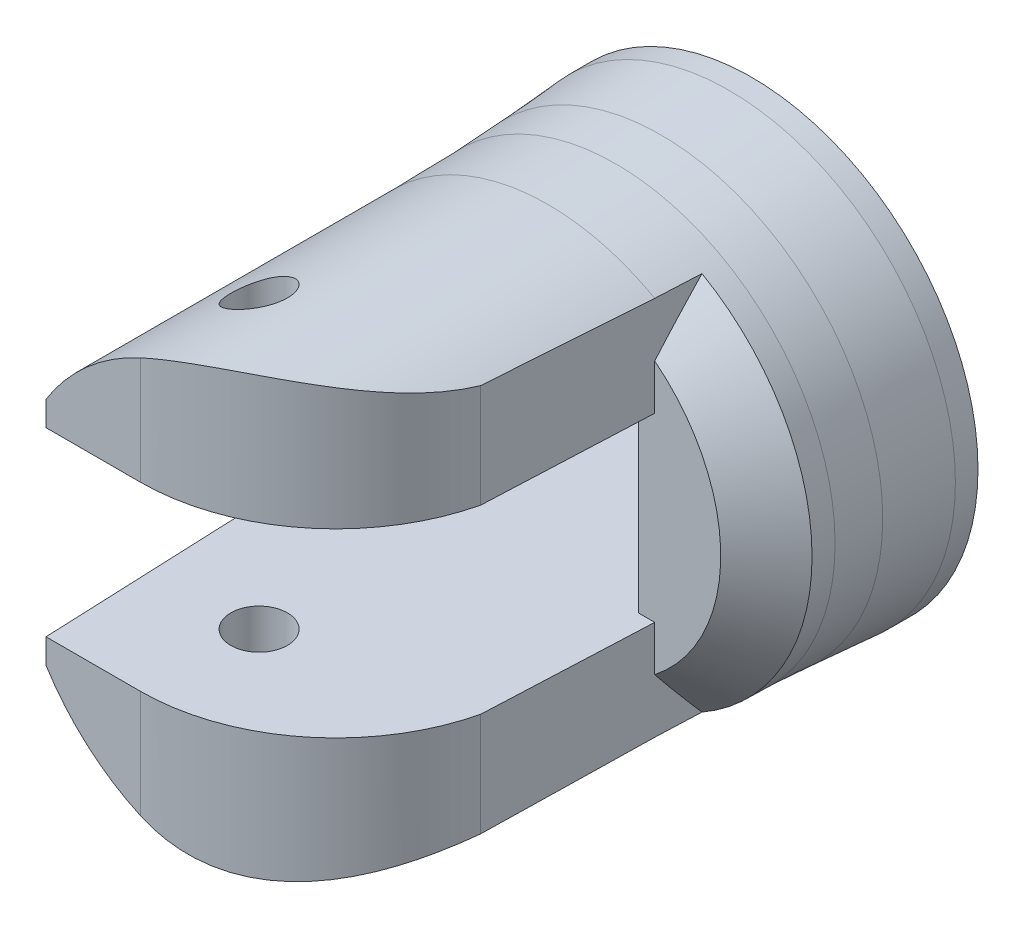
ISO-10303-21;
HEADER;
FILE_DESCRIPTION(('STEP AP214'),'2;1');
FILE_NAME('part.step','',(''),(''),'','','');
FILE_SCHEMA(('AUTOMOTIVE_DESIGN { 1 0 10303 214 1 1 1 1 }'));
ENDSEC;
DATA;
#1=APPLICATION_CONTEXT('core data for automotive mechanical design processes');
#2=APPLICATION_PROTOCOL_DEFINITION('international standard','automotive_design',2000,#1);
#3=PRODUCT_CONTEXT('',#1,'mechanical');
#4=PRODUCT('Part','Part','',(#3));
#5=PRODUCT_RELATED_PRODUCT_CATEGORY('part','',(#4));
#6=PRODUCT_DEFINITION_FORMATION('','',#4);
#7=PRODUCT_DEFINITION_CONTEXT('part definition',#1,'design');
#8=PRODUCT_DEFINITION('design','',#6,#7);
#9=PRODUCT_DEFINITION_SHAPE('','',#8);
#10=(LENGTH_UNIT() NAMED_UNIT(*) SI_UNIT(.MILLI.,.METRE.));
#11=(NAMED_UNIT(*) PLANE_ANGLE_UNIT() SI_UNIT($,.RADIAN.));
#12=(NAMED_UNIT(*) SI_UNIT($,.STERADIAN.) SOLID_ANGLE_UNIT());
#13=UNCERTAINTY_MEASURE_WITH_UNIT(LENGTH_MEASURE(1.E-05),#10,'distance_accuracy_value','');
#14=(GEOMETRIC_REPRESENTATION_CONTEXT(3) GLOBAL_UNCERTAINTY_ASSIGNED_CONTEXT((#13)) GLOBAL_UNIT_ASSIGNED_CONTEXT((#10,
#11,#12)) REPRESENTATION_CONTEXT('',''));
#15=CARTESIAN_POINT('',(0.,0.,0.));
#16=DIRECTION('',(0.,0.,1.));
#17=DIRECTION('',(1.,0.,0.));
#18=AXIS2_PLACEMENT_3D('',#15,#16,#17);
#19=CARTESIAN_POINT('',(13.,-4.,9.));
#20=DIRECTION('',(0.,0.,1.));
#21=DIRECTION('',(1.,0.,0.));
#22=AXIS2_PLACEMENT_3D('',#19,#20,#21);
#23=PLANE('',#22);
#24=DIRECTION('',(0.,-1.,0.));
#25=VECTOR('',#24,1.);
#26=CARTESIAN_POINT('',(4.71669943852547,13.,9.));
#27=LINE('',#26,#25);
#28=CARTESIAN_POINT('',(4.71669943852547,-3.99999999999999,9.));
#29=VERTEX_POINT('',#28);
#30=CARTESIAN_POINT('',(4.71669943852547,-6.00133550920778,9.));
#31=VERTEX_POINT('',#30);
#32=EDGE_CURVE('E187',#29,#31,#27,.T.);
#33=ORIENTED_EDGE('',*,*,#32,.T.);
#34=CARTESIAN_POINT('',(0.,0.,9.));
#35=DIRECTION('',(0.,0.,1.));
#36=DIRECTION('',(1.,0.,0.));
#37=AXIS2_PLACEMENT_3D('',#34,#35,#36);
#38=CIRCLE('',#37,7.63303881081872);
#39=CARTESIAN_POINT('',(4.71669943852547,6.00133550920779,9.));
#40=VERTEX_POINT('',#39);
#41=EDGE_CURVE('E241',#31,#40,#38,.T.);
#42=ORIENTED_EDGE('',*,*,#41,.T.);
#43=CARTESIAN_POINT('',(4.71669943852547,4.,9.));
#44=VERTEX_POINT('',#43);
#45=EDGE_CURVE('E190',#40,#44,#27,.T.);
#46=ORIENTED_EDGE('',*,*,#45,.T.);
#47=DIRECTION('',(-1.,0.,0.));
#48=VECTOR('',#47,1.);
#49=CARTESIAN_POINT('',(13.,4.,9.));
#50=LINE('',#49,#48);
#51=CARTESIAN_POINT('',(4.,4.,9.));
#52=VERTEX_POINT('',#51);
#53=EDGE_CURVE('E287',#44,#52,#50,.T.);
#54=ORIENTED_EDGE('',*,*,#53,.T.);
#55=DIRECTION('',(0.,1.,0.));
#56=VECTOR('',#55,1.);
#57=CARTESIAN_POINT('',(4.,-4.,9.));
#58=LINE('',#57,#56);
#59=CARTESIAN_POINT('',(4.,-4.,9.));
#60=VERTEX_POINT('',#59);
#61=EDGE_CURVE('E244',#60,#52,#58,.T.);
#62=ORIENTED_EDGE('',*,*,#61,.F.);
#63=DIRECTION('',(-1.,0.,0.));
#64=VECTOR('',#63,1.);
#65=CARTESIAN_POINT('',(13.,-4.,9.));
#66=LINE('',#65,#64);
#67=EDGE_CURVE('E291',#29,#60,#66,.T.);
#68=ORIENTED_EDGE('',*,*,#67,.F.);
#69=EDGE_LOOP('',(#33,#42,#46,#54,#62,#68));
#70=FACE_BOUND('',#69,.T.);
#71=ADVANCED_FACE('F33',(#70),#23,.T.);
#72=CARTESIAN_POINT('',(0.,0.,23.));
#73=DIRECTION('',(0.,0.,-1.));
#74=DIRECTION('',(-1.,0.,0.));
#75=AXIS2_PLACEMENT_3D('',#72,#73,#74);
#76=CYLINDRICAL_SURFACE('',#75,9.63303881081873);
#77=CARTESIAN_POINT('',(-3.76330056147453,8.86752533769966,19.25));
#78=CARTESIAN_POINT('',(-3.84052638297433,8.83474952902866,19.2499971918312));
#79=CARTESIAN_POINT('',(-3.91738770307995,8.80092839083558,19.2428267136695));
#80=CARTESIAN_POINT('',(-4.06817143072535,8.73225706821625,19.2146837344494));
#81=CARTESIAN_POINT('',(-4.14208817010863,8.69740510475551,19.1936858605097));
#82=CARTESIAN_POINT('',(-4.28489639896187,8.62794274183643,19.1385469019413));
#83=CARTESIAN_POINT('',(-4.35379212544453,8.59333216152438,19.1044170552013));
#84=CARTESIAN_POINT('',(-4.48474205368213,8.5257233174432,19.023688124717));
#85=CARTESIAN_POINT('',(-4.54679750533124,8.49272475973173,18.9770913243567));
#86=CARTESIAN_POINT('',(-4.66154789754643,8.43028094840312,18.8727023797241));
#87=CARTESIAN_POINT('',(-4.71432719410033,8.40080454769463,18.8150223220903));
#88=CARTESIAN_POINT('',(-4.80904726654804,8.34694413062424,18.6892702893568));
#89=CARTESIAN_POINT('',(-4.85099675029063,8.32255602599933,18.6212067337451));
#90=CARTESIAN_POINT('',(-4.9178841435086,8.28318786599188,18.4843504864378));
#91=CARTESIAN_POINT('',(-4.94417052862408,8.2674759310743,18.4164314531906));
#92=CARTESIAN_POINT('',(-4.98465370287303,8.24313266652622,18.2759009723148));
#93=CARTESIAN_POINT('',(-4.99886705151034,8.23449163896316,18.2032960994841));
#94=CARTESIAN_POINT('',(-5.01314140697923,8.22580717618073,18.066622611597));
#95=CARTESIAN_POINT('',(-5.01491508105391,8.22472341686919,18.0027935623712));
#96=CARTESIAN_POINT('',(-5.00873608100559,8.22848795216956,17.875793487825));
#97=CARTESIAN_POINT('',(-5.00078581387147,8.23333477877043,17.8126223035648));
#98=CARTESIAN_POINT('',(-4.97626441315554,8.2481765903373,17.6920906398408));
#99=CARTESIAN_POINT('',(-4.96016044011636,8.25789233391496,17.6345986127546));
#100=CARTESIAN_POINT('',(-4.92033989775382,8.28168021191937,17.5232859041813));
#101=CARTESIAN_POINT('',(-4.89662184700754,8.29575319408752,17.469465939617));
#102=CARTESIAN_POINT('',(-4.84057325422574,8.32858987889478,17.3629337052306));
#103=CARTESIAN_POINT('',(-4.80776018366634,8.34761085138784,17.3105560071497));
#104=CARTESIAN_POINT('',(-4.73553350234476,8.38879535022347,17.2119626527495));
#105=CARTESIAN_POINT('',(-4.69611680437899,8.41096034565388,17.1657498967839));
#106=CARTESIAN_POINT('',(-4.60617661848076,8.46058736483067,17.0744266639052));
#107=CARTESIAN_POINT('',(-4.55487460346921,8.48836294695505,17.0302530939963));
#108=CARTESIAN_POINT('',(-4.44648846054076,8.54563863569918,16.9510648551324));
#109=CARTESIAN_POINT('',(-4.38940124698179,8.57513965903,16.9160551099174));
#110=CARTESIAN_POINT('',(-4.2638527933937,8.63831430434848,16.8521942022885));
#111=CARTESIAN_POINT('',(-4.19483843046514,8.67207775559448,16.8245135654878));
#112=CARTESIAN_POINT('',(-4.05286653780626,8.73932970277915,16.7817426625145));
#113=CARTESIAN_POINT('',(-3.97990775813761,8.77281810764038,16.766656412548));
#114=CARTESIAN_POINT('',(-3.82902173632939,8.83974490928304,16.7493350132598));
#115=CARTESIAN_POINT('',(-3.75101126141533,8.87313211257912,16.7476150171703));
#116=CARTESIAN_POINT('',(-3.59503311564411,8.93746526468799,16.7589136546932));
#117=CARTESIAN_POINT('',(-3.51706543928293,8.96841171426469,16.7719292565784));
#118=CARTESIAN_POINT('',(-3.36700199892969,9.02579216801928,16.8120489692144));
#119=CARTESIAN_POINT('',(-3.29479670852231,9.05235973348971,16.8385491607791));
#120=CARTESIAN_POINT('',(-3.15550005049789,9.10185241270249,16.9050003247795));
#121=CARTESIAN_POINT('',(-3.0884063042642,9.12477922609298,16.9449449934669));
#122=CARTESIAN_POINT('',(-2.96661790827143,9.16506630666774,17.0340421922385));
#123=CARTESIAN_POINT('',(-2.91137787149689,9.18270889913973,17.0823221244777));
#124=CARTESIAN_POINT('',(-2.80974002230003,9.21431686525695,17.1884496334102));
#125=CARTESIAN_POINT('',(-2.76333910737749,9.22828352979908,17.2462938397117));
#126=CARTESIAN_POINT('',(-2.68358690364123,9.25178002548903,17.3662736136852));
#127=CARTESIAN_POINT('',(-2.64964019344308,9.26151823992256,17.4279733310753));
#128=CARTESIAN_POINT('',(-2.59248457023859,9.27768009477839,17.5565623588208));
#129=CARTESIAN_POINT('',(-2.56927358820357,9.28410437390192,17.6234506663082));
#130=CARTESIAN_POINT('',(-2.53497542251719,9.29352704497164,17.7583141509593));
#131=CARTESIAN_POINT('',(-2.52354088511634,9.29662371509397,17.8261943558342));
#132=CARTESIAN_POINT('',(-2.5119656568521,9.29975821251947,17.9629792017646));
#133=CARTESIAN_POINT('',(-2.51182402681525,9.29979629418983,18.0318837571533));
#134=CARTESIAN_POINT('',(-2.52277839830451,9.2968304264296,18.1679737492465));
#135=CARTESIAN_POINT('',(-2.53375311608274,9.2938593085853,18.2351697140441));
#136=CARTESIAN_POINT('',(-2.56637983065348,9.28490251389005,18.3667041845718));
#137=CARTESIAN_POINT('',(-2.58803161778194,9.27891689623435,18.4310427463853));
#138=CARTESIAN_POINT('',(-2.64134270027211,9.26388200646918,18.5552376583404));
#139=CARTESIAN_POINT('',(-2.67302735156281,9.25482496783525,18.6150821713804));
#140=CARTESIAN_POINT('',(-2.74531068591012,9.23364062139377,18.728505102459));
#141=CARTESIAN_POINT('',(-2.78590931357352,9.2215133326653,18.7820835594329));
#142=CARTESIAN_POINT('',(-2.87542005204634,9.19399907234616,18.8824771952337));
#143=CARTESIAN_POINT('',(-2.92445944805667,9.17856113953449,18.9291647642708));
#144=CARTESIAN_POINT('',(-3.02877295145332,9.14466922300669,19.0136452783533));
#145=CARTESIAN_POINT('',(-3.08404934509272,9.1262141321917,19.0514349459858));
#146=CARTESIAN_POINT('',(-3.20127743556033,9.08577145736655,19.118644372223));
#147=CARTESIAN_POINT('',(-3.26340135568711,9.06367766939595,19.1476987421685));
#148=CARTESIAN_POINT('',(-3.39060939522998,9.01686125698279,19.1950744113292));
#149=CARTESIAN_POINT('',(-3.4556909971951,8.99214084508517,19.2134046606663));
#150=CARTESIAN_POINT('',(-3.5614655407384,8.9506014786468,19.2342760025017));
#151=CARTESIAN_POINT('',(-3.60179185391843,8.93445199406293,19.2401856506724));
#152=CARTESIAN_POINT('',(-3.68254543431901,8.90147178896684,19.2480483082781));
#153=CARTESIAN_POINT('',(-3.72297269768743,8.88464109408691,19.2500014664454));
#154=CARTESIAN_POINT('',(-3.76330056147453,8.86752533769966,19.25));
#155=B_SPLINE_CURVE_WITH_KNOTS('',3,(#77,#78,#79,#80,#81,#82,#83,#84,#85,#86,#87,#88,#89,#90,
#91,#92,#93,#94,#95,#96,#97,#98,#99,#100,#101,#102,#103,#104,#105,#106,#107,#108,#109,#110,#111,
#112,#113,#114,#115,#116,#117,#118,#119,#120,#121,#122,#123,#124,#125,#126,#127,#128,#129,#130,
#131,#132,#133,#134,#135,#136,#137,#138,#139,#140,#141,#142,#143,#144,#145,#146,#147,#148,#149,
#150,#151,#152,#153,#154),.UNSPECIFIED.,.T.,.F.,(4,2,2,2,2,2,2,2,2,2,2,2,2,2,2,2,2,2,2,2,2,2,2,
2,2,2,2,2,2,2,2,2,2,2,2,2,2,2,4),(0.,0.251516649401332,0.503496115645326,0.755260424450386,
1.00697865291168,1.25627378749595,1.50536784441701,1.72754330773914,1.94941353849924,
2.14000525817282,2.33054980979861,2.51123893925648,2.6919632455839,2.88519778843758,
3.07852292205062,3.29716561755611,3.51592555015249,3.75983186253976,4.00381592418566,
4.25715896627353,4.51044989459721,4.75328219288683,4.99600079198325,5.22120215756562,
5.44632433203758,5.65854626437789,5.87072727947397,6.07645321924869,6.28216204982907,
6.48565043632798,6.68913482711432,6.89313764201472,7.09713918923701,7.3045408954607,
7.51201887600634,7.72724718086034,7.94229560358608,8.07364429372463,8.20498804611538),.UNSPECIFIED.);
#156=CARTESIAN_POINT('',(-3.76330056147453,8.86752533769966,19.25));
#157=VERTEX_POINT('',#156);
#158=EDGE_CURVE('E357',#157,#157,#155,.T.);
#159=ORIENTED_EDGE('',*,*,#158,.T.);
#160=EDGE_LOOP('',(#159));
#161=FACE_BOUND('',#160,.T.);
#162=CARTESIAN_POINT('',(0.,0.,218.961876170055));
#163=DIRECTION('',(-0.99913012356165,0.,0.0417012732621155));
#164=DIRECTION('',(-0.0417012732621155,0.,-0.99913012356165));
#165=AXIS2_PLACEMENT_3D('',#162,#163,#164);
#166=ELLIPSE('',#165,231.001071604451,9.63303881081873);
#167=CARTESIAN_POINT('',(-8.17897444428325,5.08918596344262,23.));
#168=VERTEX_POINT('',#167);
#169=CARTESIAN_POINT('',(-8.76330056147453,4.,9.));
#170=VERTEX_POINT('',#169);
#171=EDGE_CURVE('E294',#168,#170,#166,.T.);
#172=ORIENTED_EDGE('',*,*,#171,.F.);
#173=CARTESIAN_POINT('',(0.,0.,23.));
#174=DIRECTION('',(0.,0.,1.));
#175=DIRECTION('',(1.,0.,0.));
#176=AXIS2_PLACEMENT_3D('',#173,#174,#175);
#177=CIRCLE('',#176,9.63303881081873);
#178=CARTESIAN_POINT('',(-4.00897444428325,8.75919862977337,23.));
#179=VERTEX_POINT('',#178);
#180=EDGE_CURVE('E283',#179,#168,#177,.T.);
#181=ORIENTED_EDGE('',*,*,#180,.F.);
#182=CARTESIAN_POINT('',(4.38845373343878,8.57536649713627,16.36));
#183=CARTESIAN_POINT('',(4.33202970734504,8.60419678798904,16.5981641900852));
#184=CARTESIAN_POINT('',(4.26558967142315,8.6375417494693,16.8333149451174));
#185=CARTESIAN_POINT('',(4.11347779077477,8.71103096370049,17.2960685920147));
#186=CARTESIAN_POINT('',(4.02781771971353,8.75117105026417,17.5236760071708));
#187=CARTESIAN_POINT('',(3.83783996183784,8.8361305045391,17.9704814233858));
#188=CARTESIAN_POINT('',(3.73349198915075,8.88095741796206,18.1896650617954));
#189=CARTESIAN_POINT('',(3.5069345580317,8.97283686630406,18.6181462313554));
#190=CARTESIAN_POINT('',(3.38472236483708,9.01988974123944,18.8274422423454));
#191=CARTESIAN_POINT('',(3.12326287607445,9.11372200783125,19.2348341819239));
#192=CARTESIAN_POINT('',(2.98403455208995,9.16050164421996,19.4329422301613));
#193=CARTESIAN_POINT('',(2.68908971316785,9.25138060598619,19.8171536731392));
#194=CARTESIAN_POINT('',(2.53337309817076,9.29547991509554,20.0032569950177));
#195=CARTESIAN_POINT('',(2.20637168604013,9.37847430868507,20.3620968593353));
#196=CARTESIAN_POINT('',(2.03510585081388,9.41737559259425,20.5348492191863));
#197=CARTESIAN_POINT('',(1.67774266749133,9.48755770041677,20.8659561348197));
#198=CARTESIAN_POINT('',(1.49164843433219,9.5188401192205,21.0243136995697));
#199=CARTESIAN_POINT('',(1.141148799955,9.56653107042531,21.2977041515749));
#200=CARTESIAN_POINT('',(0.979012139481499,9.58461432598518,21.4153604239651));
#201=CARTESIAN_POINT('',(0.646467381660679,9.61276995564597,21.6393833220172));
#202=CARTESIAN_POINT('',(0.476060837823081,9.62284382818808,21.745752056188));
#203=CARTESIAN_POINT('',(0.128102292165628,9.63375851688759,21.9463977677203));
#204=CARTESIAN_POINT('',(-0.0494454810249828,9.63460471865517,22.0406817664199));
#205=CARTESIAN_POINT('',(-0.410501489893694,9.62598186919501,22.2165411491977));
#206=CARTESIAN_POINT('',(-0.594009660596684,9.61651293037746,22.2981166717564));
#207=CARTESIAN_POINT('',(-0.966408466297942,9.58626923768393,22.4483788041856));
#208=CARTESIAN_POINT('',(-1.15532140458578,9.56543825883925,22.5169990124715));
#209=CARTESIAN_POINT('',(-1.53593983683502,9.51174339498795,22.6404916212929));
#210=CARTESIAN_POINT('',(-1.7276455970081,9.47887835559315,22.6953627020687));
#211=CARTESIAN_POINT('',(-2.11191019535822,9.40072858540795,22.791237882455));
#212=CARTESIAN_POINT('',(-2.30446868857813,9.35544849282434,22.8322471480257));
#213=CARTESIAN_POINT('',(-2.68857214243997,9.25238024106376,22.9006199217084));
#214=CARTESIAN_POINT('',(-2.88011750108682,9.19459743604525,22.9279892544603));
#215=CARTESIAN_POINT('',(-3.22945905809074,9.0771264405432,22.966213950929));
#216=CARTESIAN_POINT('',(-3.38766875453895,9.01928293594592,22.9790335045416));
#217=CARTESIAN_POINT('',(-3.70086103127718,8.89536168969154,22.9959245723067));
#218=CARTESIAN_POINT('',(-3.85585055609033,8.82930442655352,23.0000173988001));
#219=CARTESIAN_POINT('',(-4.00897444428325,8.75919862977337,23.));
#220=B_SPLINE_CURVE_WITH_KNOTS('',3,(#182,#183,#184,#185,#186,#187,#188,#189,#190,#191,#192,
#193,#194,#195,#196,#197,#198,#199,#200,#201,#202,#203,#204,#205,#206,#207,#208,#209,#210,#211,
#212,#213,#214,#215,#216,#217,#218,#219),.UNSPECIFIED.,.F.,.F.,(4,2,2,2,2,2,2,2,2,2,2,2,2,2,2,2,
2,2,4),(0.,0.738955956304504,1.47746047837301,2.21717284350567,2.9569985670953,3.6960068443424,
4.43501960653133,5.17314296416181,5.91111167413572,6.5139417444348,7.11665900728077,
7.71902448318639,8.32138339482583,8.92675048063638,9.53217565255628,10.1373749478853,
10.742315583956,11.24868366117,11.7538136672718),.UNSPECIFIED.);
#221=CARTESIAN_POINT('',(4.38845373343878,8.57536649713627,16.36));
#222=VERTEX_POINT('',#221);
#223=EDGE_CURVE('E202',#222,#179,#220,.T.);
#224=ORIENTED_EDGE('',*,*,#223,.F.);
#225=CARTESIAN_POINT('',(0.,0.,114.758909650863));
#226=DIRECTION('',(0.999006963527056,0.,0.0445543131969369));
#227=DIRECTION('',(0.0445543131969369,0.,-0.999006963527056));
#228=AXIS2_PLACEMENT_3D('',#225,#226,#227);
#229=ELLIPSE('',#228,216.208894708784,9.63303881081873);
#230=CARTESIAN_POINT('',(4.71669943852547,8.39929658586602,9.));
#231=VERTEX_POINT('',#230);
#232=EDGE_CURVE('E302',#231,#222,#229,.T.);
#233=ORIENTED_EDGE('',*,*,#232,.F.);
#234=CARTESIAN_POINT('',(0.,0.,9.));
#235=DIRECTION('',(0.,0.,1.));
#236=DIRECTION('',(1.,0.,0.));
#237=AXIS2_PLACEMENT_3D('',#234,#235,#236);
#238=CIRCLE('',#237,9.63303881081873);
#239=EDGE_CURVE('E278',#231,#170,#238,.T.);
#240=ORIENTED_EDGE('',*,*,#239,.T.);
#241=EDGE_LOOP('',(#172,#181,#224,#233,#240));
#242=FACE_BOUND('',#241,.T.);
#243=ADVANCED_FACE('F208',(#161,#242),#76,.T.);
#244=CARTESIAN_POINT('',(-3.76330056147453,-8.86752533769966,19.25));
#245=CARTESIAN_POINT('',(-3.6914429988906,-8.89802001359438,19.2499979003967));
#246=CARTESIAN_POINT('',(-3.61917717595181,-8.92764964217676,19.2437926619706));
#247=CARTESIAN_POINT('',(-3.47583052107504,-8.98443043551801,19.2186709656711));
#248=CARTESIAN_POINT('',(-3.40475037100665,-9.01158021175248,19.1997474355048));
#249=CARTESIAN_POINT('',(-3.26584873271217,-9.06284521637875,19.1491375268033));
#250=CARTESIAN_POINT('',(-3.19803645780768,-9.08695214376152,19.1174171855865));
#251=CARTESIAN_POINT('',(-3.06833214608374,-9.13156512423464,19.0417062481141));
#252=CARTESIAN_POINT('',(-3.006437848006,-9.15207255521559,18.997720363885));
#253=CARTESIAN_POINT('',(-2.89420927056528,-9.18815973696708,18.9013033630188));
#254=CARTESIAN_POINT('',(-2.84342445072692,-9.20394958522005,18.8494753356414));
#255=CARTESIAN_POINT('',(-2.75123202124587,-9.23192755401694,18.7372161491673));
#256=CARTESIAN_POINT('',(-2.70982183670661,-9.24411666384355,18.6767873598554));
#257=CARTESIAN_POINT('',(-2.6398291562505,-9.26434043339579,18.5524000333008));
#258=CARTESIAN_POINT('',(-2.61070202644629,-9.272554633447,18.4887765863215));
#259=CARTESIAN_POINT('',(-2.56340771375594,-9.28574095982724,18.3572637761404));
#260=CARTESIAN_POINT('',(-2.54523870206362,-9.2907136271486,18.2893751268499));
#261=CARTESIAN_POINT('',(-2.52083322710868,-9.29736486908527,18.153116864791));
#262=CARTESIAN_POINT('',(-2.51430582553809,-9.29912378766452,18.0848031154134));
#263=CARTESIAN_POINT('',(-2.51251076471201,-9.29960901593624,17.9480189840441));
#264=CARTESIAN_POINT('',(-2.51724233621377,-9.29833553281039,17.8795486130724));
#265=CARTESIAN_POINT('',(-2.53772142493407,-9.29276686431823,17.7449397179907));
#266=CARTESIAN_POINT('',(-2.55338491120396,-9.28849472744672,17.6787874224478));
#267=CARTESIAN_POINT('',(-2.59510158134983,-9.27692564935196,17.5501284027046));
#268=CARTESIAN_POINT('',(-2.62115463320225,-9.26962874656534,17.487621632191));
#269=CARTESIAN_POINT('',(-2.68293023303208,-9.25193788882846,17.3676418851525));
#270=CARTESIAN_POINT('',(-2.71870317218373,-9.24152776476018,17.3101972675645));
#271=CARTESIAN_POINT('',(-2.7986476714642,-9.21763219979893,17.2022163264539));
#272=CARTESIAN_POINT('',(-2.84281967752426,-9.20414659561206,17.1516803699775));
#273=CARTESIAN_POINT('',(-2.9391005819451,-9.17386052790291,17.0577636973481));
#274=CARTESIAN_POINT('',(-2.99135405574441,-9.15699758208732,17.0145515533039));
#275=CARTESIAN_POINT('',(-3.10141664596622,-9.12030780195359,16.9374908484812));
#276=CARTESIAN_POINT('',(-3.15922663883377,-9.10048049978447,16.9036437681564));
#277=CARTESIAN_POINT('',(-3.28118206619585,-9.05724207740405,16.8446471610304));
#278=CARTESIAN_POINT('',(-3.34549154393996,-9.03371550086436,16.8199221046218));
#279=CARTESIAN_POINT('',(-3.4763824604696,-8.98415845788367,16.7814616920382));
#280=CARTESIAN_POINT('',(-3.54296452658563,-8.95812729640491,16.7677293963327));
#281=CARTESIAN_POINT('',(-3.68092393721621,-8.90236549239213,16.7506615939307));
#282=CARTESIAN_POINT('',(-3.75233715295004,-8.87250488052704,16.7480421638606));
#283=CARTESIAN_POINT('',(-3.89393696776871,-8.81127975398201,16.7548238034606));
#284=CARTESIAN_POINT('',(-3.96412313105413,-8.779914719225,16.7642290592984));
#285=CARTESIAN_POINT('',(-4.10622927272964,-8.71440389590808,16.7956159296635));
#286=CARTESIAN_POINT('',(-4.17795294205371,-8.68021211624073,16.8183941049427));
#287=CARTESIAN_POINT('',(-4.3163645853494,-8.61222312789543,16.8764974456643));
#288=CARTESIAN_POINT('',(-4.3830505207869,-8.5784260835755,16.9118276576957));
#289=CARTESIAN_POINT('',(-4.51121264104242,-8.5117416439172,16.9954458431562));
#290=CARTESIAN_POINT('',(-4.5725136780731,-8.47889909616142,17.0440398864696));
#291=CARTESIAN_POINT('',(-4.68588826832578,-8.41677314037111,17.1529443311315));
#292=CARTESIAN_POINT('',(-4.73796382537722,-8.38748895987303,17.2132521821901));
#293=CARTESIAN_POINT('',(-4.82747488218591,-8.33627080223374,17.3399686100264));
#294=CARTESIAN_POINT('',(-4.86565596286593,-8.31397650511851,17.4057005525626));
#295=CARTESIAN_POINT('',(-4.92988818063978,-8.27605248379204,17.5445863276203));
#296=CARTESIAN_POINT('',(-4.95595751070134,-8.26041276678112,17.6177288261659));
#297=CARTESIAN_POINT('',(-4.99148302542132,-8.2389867182395,17.7580461403171));
#298=CARTESIAN_POINT('',(-5.00277308113328,-8.23211629117008,17.8245927715326));
#299=CARTESIAN_POINT('',(-5.0144417417793,-8.22501450693771,17.9589738420669));
#300=CARTESIAN_POINT('',(-5.01482779210792,-8.22477861962646,18.0268073710048));
#301=CARTESIAN_POINT('',(-5.00520079396966,-8.23063921998933,18.1544783544265));
#302=CARTESIAN_POINT('',(-4.99623820369644,-8.23609605523225,18.2144291721509));
#303=CARTESIAN_POINT('',(-4.96996527031959,-8.25197645938227,18.3317762550788));
#304=CARTESIAN_POINT('',(-4.95265440636269,-8.2624003381854,18.3891723606484));
#305=CARTESIAN_POINT('',(-4.909990042507,-8.28782598880796,18.5012788435394));
#306=CARTESIAN_POINT('',(-4.88446990285094,-8.30292234294913,18.5559037243082));
#307=CARTESIAN_POINT('',(-4.8264806752136,-8.33676472723144,18.6600804287084));
#308=CARTESIAN_POINT('',(-4.79400928232211,-8.35551196775402,18.7096305615684));
#309=CARTESIAN_POINT('',(-4.71904450336259,-8.39810182273752,18.8082792668509));
#310=CARTESIAN_POINT('',(-4.67583096163512,-8.42228155974854,18.8566839897143));
#311=CARTESIAN_POINT('',(-4.5832190852392,-8.47303551795469,18.9457090676348));
#312=CARTESIAN_POINT('',(-4.53381628694137,-8.49961146335422,18.9863237505438));
#313=CARTESIAN_POINT('',(-4.42312391216875,-8.55779241331916,19.0640907242879));
#314=CARTESIAN_POINT('',(-4.3611255298654,-8.58959914591323,19.1000851362489));
#315=CARTESIAN_POINT('',(-4.23221782721759,-8.65384009559333,19.1609015970251));
#316=CARTESIAN_POINT('',(-4.16531068336754,-8.68627402994276,19.1857285629654));
#317=CARTESIAN_POINT('',(-4.04272446916246,-8.74387689871997,19.2196563755191));
#318=CARTESIAN_POINT('',(-3.98768633805696,-8.76912291729969,19.2309796178196));
#319=CARTESIAN_POINT('',(-3.8762834792378,-8.81893341748887,19.2461522648394));
#320=CARTESIAN_POINT('',(-3.81991874882035,-8.84349789770903,19.2500016543246));
#321=CARTESIAN_POINT('',(-3.76330056147453,-8.86752533769966,19.25));
#322=B_SPLINE_CURVE_WITH_KNOTS('',3,(#244,#245,#246,#247,#248,#249,#250,#251,#252,#253,#254,
#255,#256,#257,#258,#259,#260,#261,#262,#263,#264,#265,#266,#267,#268,#269,#270,#271,#272,#273,
#274,#275,#276,#277,#278,#279,#280,#281,#282,#283,#284,#285,#286,#287,#288,#289,#290,#291,#292,
#293,#294,#295,#296,#297,#298,#299,#300,#301,#302,#303,#304,#305,#306,#307,#308,#309,#310,#311,
#312,#313,#314,#315,#316,#317,#318,#319,#320,#321),.UNSPECIFIED.,.T.,.F.,(4,2,2,2,2,2,2,2,2,2,2,
2,2,2,2,2,2,2,2,2,2,2,2,2,2,2,2,2,2,2,2,2,2,2,2,2,2,2,4),(0.,0.233976888120944,0.46808399213406,
0.702816546328443,0.937459047776381,1.15909841443983,1.38067683017367,1.59100286409599,
1.80129378687414,2.00625146621254,2.2111951427035,2.41458057323808,2.61796341937066,
2.82242148117297,3.02689040128979,3.23556537538043,3.44427331853393,3.66173735305452,
3.87926191020471,4.11060838656616,4.34203542377728,4.58888966238513,4.83584326210447,
5.08906365184439,5.3422289729846,5.57848289254737,5.81438078032703,6.01676922018245,
6.21901946327496,6.40076233654358,6.58251655031479,6.76822146353266,6.95398804879231,
7.16090699936497,7.3679760462327,7.60227840673727,7.8364775006165,8.02083276967479,
8.20518841450692),.UNSPECIFIED.);
#323=CARTESIAN_POINT('',(-3.76330056147453,-8.86752533769966,19.25));
#324=VERTEX_POINT('',#323);
#325=EDGE_CURVE('E359',#324,#324,#322,.T.);
#326=ORIENTED_EDGE('',*,*,#325,.T.);
#327=EDGE_LOOP('',(#326));
#328=FACE_BOUND('',#327,.T.);
#329=CARTESIAN_POINT('',(0.,0.,218.961876170055));
#330=DIRECTION('',(-0.99913012356165,0.,0.0417012732621155));
#331=DIRECTION('',(-0.0417012732621155,0.,-0.99913012356165));
#332=AXIS2_PLACEMENT_3D('',#329,#330,#331);
#333=ELLIPSE('',#332,231.001071604451,9.63303881081873);
#334=CARTESIAN_POINT('',(-8.76330056147453,-3.99999999999999,9.));
#335=VERTEX_POINT('',#334);
#336=CARTESIAN_POINT('',(-8.17897444428325,-5.08918596344261,23.));
#337=VERTEX_POINT('',#336);
#338=EDGE_CURVE('E300',#335,#337,#333,.T.);
#339=ORIENTED_EDGE('',*,*,#338,.F.);
#340=CARTESIAN_POINT('',(4.71669943852547,-8.39929658586602,9.));
#341=VERTEX_POINT('',#340);
#342=EDGE_CURVE('E282',#335,#341,#238,.T.);
#343=ORIENTED_EDGE('',*,*,#342,.T.);
#344=CARTESIAN_POINT('',(0.,0.,114.758909650863));
#345=DIRECTION('',(0.999006963527056,0.,0.0445543131969369));
#346=DIRECTION('',(0.0445543131969369,0.,-0.999006963527056));
#347=AXIS2_PLACEMENT_3D('',#344,#345,#346);
#348=ELLIPSE('',#347,216.208894708784,9.63303881081873);
#349=CARTESIAN_POINT('',(4.38845373343878,-8.57536649713627,16.36));
#350=VERTEX_POINT('',#349);
#351=EDGE_CURVE('E304',#350,#341,#348,.T.);
#352=ORIENTED_EDGE('',*,*,#351,.F.);
#353=CARTESIAN_POINT('',(-4.00897444428325,-8.75919862977337,23.));
#354=CARTESIAN_POINT('',(-3.83535423518023,-8.83870439096423,23.0000327737368));
#355=CARTESIAN_POINT('',(-3.65930568175523,-8.91299454158436,22.9947613153382));
#356=CARTESIAN_POINT('',(-3.30368473783804,-9.05081661439623,22.9729681521229));
#357=CARTESIAN_POINT('',(-3.12411150606726,-9.11434593244957,22.9564437289146));
#358=CARTESIAN_POINT('',(-2.76338493367208,-9.23011188507487,22.9115676108561));
#359=CARTESIAN_POINT('',(-2.58223771197858,-9.28238084409063,22.8832504740692));
#360=CARTESIAN_POINT('',(-2.21940673343092,-9.37575297332639,22.8144317300558));
#361=CARTESIAN_POINT('',(-2.03772305532877,-9.4168577073767,22.7739318310079));
#362=CARTESIAN_POINT('',(-1.67499662592059,-9.48810089217592,22.6805110738947));
#363=CARTESIAN_POINT('',(-1.4939559131667,-9.51821700276491,22.6275652681283));
#364=CARTESIAN_POINT('',(-1.13443098851729,-9.5677288532928,22.5093924249953));
#365=CARTESIAN_POINT('',(-0.955946920036231,-9.58712399411713,22.4441647015577));
#366=CARTESIAN_POINT('',(-0.603042513057697,-9.61577419522768,22.3017542896738));
#367=CARTESIAN_POINT('',(-0.428621171568071,-9.62503178477198,22.2245745886617));
#368=CARTESIAN_POINT('',(-0.0850957665906844,-9.63419566159547,22.058723093439));
#369=CARTESIAN_POINT('',(0.0840083252895378,-9.63410199881592,21.9700513606052));
#370=CARTESIAN_POINT('',(0.415288981947813,-9.62550467929762,21.7820809871437));
#371=CARTESIAN_POINT('',(0.577485139808144,-9.61702672700875,21.6828156539609));
#372=CARTESIAN_POINT('',(0.894612950338622,-9.59272793454392,21.4740705692142));
#373=CARTESIAN_POINT('',(1.04954220030433,-9.57690468432721,21.3645874745622));
#374=CARTESIAN_POINT('',(1.50241107706249,-9.52001424938167,21.0216735181074));
#375=CARTESIAN_POINT('',(1.78841040494583,-9.46952720270459,20.7737901859288));
#376=CARTESIAN_POINT('',(2.36233065798654,-9.34415656433977,20.2068633989409));
#377=CARTESIAN_POINT('',(2.64461605731815,-9.2668090095068,19.8827129557497));
#378=CARTESIAN_POINT('',(3.15738772697162,-9.10486753431357,19.1973309602347));
#379=CARTESIAN_POINT('',(3.38788307193976,-9.0202748870308,18.8361059203011));
#380=CARTESIAN_POINT('',(3.67905800866237,-8.90331837671807,18.2950506773153));
#381=CARTESIAN_POINT('',(3.76228795099848,-8.86836105581286,18.1275823731657));
#382=CARTESIAN_POINT('',(3.91785547921967,-8.80074033101283,17.7871996834266));
#383=CARTESIAN_POINT('',(3.99019483917776,-8.76807655396389,17.6142861904182));
#384=CARTESIAN_POINT('',(4.123630694187,-8.7061210567092,17.2635842871943));
#385=CARTESIAN_POINT('',(4.1847272371855,-8.67682932212287,17.0857958977725));
#386=CARTESIAN_POINT('',(4.29535954415313,-8.62258902207984,16.7259315262001));
#387=CARTESIAN_POINT('',(4.34489047257888,-8.59764227435076,16.5438537855864));
#388=CARTESIAN_POINT('',(4.38845373343878,-8.57536649713627,16.36));
#389=B_SPLINE_CURVE_WITH_KNOTS('',3,(#353,#354,#355,#356,#357,#358,#359,#360,#361,#362,#363,
#364,#365,#366,#367,#368,#369,#370,#371,#372,#373,#374,#375,#376,#377,#378,#379,#380,#381,#382,
#383,#384,#385,#386,#387,#388),.UNSPECIFIED.,.F.,.F.,(4,2,2,2,2,2,2,2,2,2,2,2,2,2,2,2,2,4),(0.,
0.572771037702614,1.14568048947115,1.71692273762636,2.28808492763105,2.86040191928804,
3.43275089021507,4.00495703095772,4.57716011577825,5.147614368797,5.71825592406104,
6.85961230468074,8.16506492079339,9.47028861698718,10.0407289941295,10.6110763459006,
11.1814212652489,11.7520042185606),.UNSPECIFIED.);
#390=CARTESIAN_POINT('',(-4.00897444428325,-8.75919862977336,23.));
#391=VERTEX_POINT('',#390);
#392=EDGE_CURVE('E194',#391,#350,#389,.T.);
#393=ORIENTED_EDGE('',*,*,#392,.F.);
#394=EDGE_CURVE('E286',#337,#391,#177,.T.);
#395=ORIENTED_EDGE('',*,*,#394,.F.);
#396=EDGE_LOOP('',(#339,#343,#352,#393,#395));
#397=FACE_BOUND('',#396,.T.);
#398=ADVANCED_FACE('F345',(#328,#397),#76,.T.);
#399=CARTESIAN_POINT('',(0.,0.,23.));
#400=DIRECTION('',(0.,0.,1.));
#401=DIRECTION('',(1.,0.,0.));
#402=AXIS2_PLACEMENT_3D('',#399,#400,#401);
#403=PLANE('',#402);
#404=ORIENTED_EDGE('',*,*,#180,.T.);
#405=DIRECTION('',(0.,-1.,0.));
#406=VECTOR('',#405,1.);
#407=CARTESIAN_POINT('',(-8.17897444428325,13.,23.));
#408=LINE('',#407,#406);
#409=CARTESIAN_POINT('',(-8.17897444428325,4.,23.));
#410=VERTEX_POINT('',#409);
#411=EDGE_CURVE('E179',#168,#410,#408,.T.);
#412=ORIENTED_EDGE('',*,*,#411,.T.);
#413=DIRECTION('',(1.,0.,0.));
#414=VECTOR('',#413,1.);
#415=CARTESIAN_POINT('',(0.,4.,23.));
#416=LINE('',#415,#414);
#417=CARTESIAN_POINT('',(-4.00897444428325,4.,23.));
#418=VERTEX_POINT('',#417);
#419=EDGE_CURVE('E260',#410,#418,#416,.T.);
#420=ORIENTED_EDGE('',*,*,#419,.T.);
#421=DIRECTION('',(0.,-1.,0.));
#422=VECTOR('',#421,1.);
#423=CARTESIAN_POINT('',(-4.00897444428325,13.,23.));
#424=LINE('',#423,#422);
#425=EDGE_CURVE('E182',#179,#418,#424,.T.);
#426=ORIENTED_EDGE('',*,*,#425,.F.);
#427=EDGE_LOOP('',(#404,#412,#420,#426));
#428=FACE_BOUND('',#427,.T.);
#429=ADVANCED_FACE('F319',(#428),#403,.T.);
#430=DIRECTION('',(-1.,0.,0.));
#431=VECTOR('',#430,1.);
#432=CARTESIAN_POINT('',(0.,-4.,23.));
#433=LINE('',#432,#431);
#434=CARTESIAN_POINT('',(-4.00897444428325,-3.99999999999999,23.));
#435=VERTEX_POINT('',#434);
#436=CARTESIAN_POINT('',(-8.17897444428325,-4.,23.));
#437=VERTEX_POINT('',#436);
#438=EDGE_CURVE('E263',#435,#437,#433,.T.);
#439=ORIENTED_EDGE('',*,*,#438,.T.);
#440=EDGE_CURVE('E174',#437,#337,#408,.T.);
#441=ORIENTED_EDGE('',*,*,#440,.T.);
#442=ORIENTED_EDGE('',*,*,#394,.T.);
#443=EDGE_CURVE('E180',#435,#391,#424,.T.);
#444=ORIENTED_EDGE('',*,*,#443,.F.);
#445=EDGE_LOOP('',(#439,#441,#442,#444));
#446=FACE_BOUND('',#445,.T.);
#447=ADVANCED_FACE('F352',(#446),#403,.T.);
#448=CARTESIAN_POINT('',(13.,4.,9.));
#449=DIRECTION('',(0.,-1.,0.));
#450=DIRECTION('',(0.,0.,-1.));
#451=AXIS2_PLACEMENT_3D('',#448,#449,#450);
#452=PLANE('',#451);
#453=CARTESIAN_POINT('',(-3.76330056147453,4.,18.));
#454=DIRECTION('',(0.,-1.,0.));
#455=DIRECTION('',(0.,0.,-1.));
#456=AXIS2_PLACEMENT_3D('',#453,#454,#455);
#457=CIRCLE('',#456,1.25);
#458=CARTESIAN_POINT('',(-3.76330056147453,4.,16.75));
#459=VERTEX_POINT('',#458);
#460=EDGE_CURVE('E248',#459,#459,#457,.T.);
#461=ORIENTED_EDGE('',*,*,#460,.F.);
#462=EDGE_LOOP('',(#461));
#463=FACE_BOUND('',#462,.T.);
#464=CARTESIAN_POINT('',(-4.,4.,9.));
#465=VERTEX_POINT('',#464);
#466=EDGE_CURVE('E290',#465,#170,#50,.T.);
#467=ORIENTED_EDGE('',*,*,#466,.F.);
#468=DIRECTION('',(0.,0.,-1.));
#469=VECTOR('',#468,1.);
#470=CARTESIAN_POINT('',(-4.,4.,13.));
#471=LINE('',#470,#469);
#472=CARTESIAN_POINT('',(-4.,4.,0.));
#473=VERTEX_POINT('',#472);
#474=EDGE_CURVE('E152',#465,#473,#471,.T.);
#475=ORIENTED_EDGE('',*,*,#474,.T.);
#476=DIRECTION('',(1.,0.,0.));
#477=VECTOR('',#476,1.);
#478=CARTESIAN_POINT('',(4.,4.,0.));
#479=LINE('',#478,#477);
#480=CARTESIAN_POINT('',(4.,4.,0.));
#481=VERTEX_POINT('',#480);
#482=EDGE_CURVE('E167',#473,#481,#479,.T.);
#483=ORIENTED_EDGE('',*,*,#482,.T.);
#484=DIRECTION('',(0.,0.,-1.));
#485=VECTOR('',#484,1.);
#486=CARTESIAN_POINT('',(4.,4.,13.));
#487=LINE('',#486,#485);
#488=EDGE_CURVE('E172',#52,#481,#487,.T.);
#489=ORIENTED_EDGE('',*,*,#488,.F.);
#490=ORIENTED_EDGE('',*,*,#53,.F.);
#491=DIRECTION('',(-0.0445543131969369,0.,0.999006963527056));
#492=VECTOR('',#491,1.);
#493=CARTESIAN_POINT('',(4.73314250933302,4.,8.63130971931044));
#494=LINE('',#493,#492);
#495=CARTESIAN_POINT('',(4.38845373343878,4.00000000000001,16.36));
#496=VERTEX_POINT('',#495);
#497=EDGE_CURVE('E306',#44,#496,#494,.T.);
#498=ORIENTED_EDGE('',*,*,#497,.T.);
#499=CARTESIAN_POINT('',(-4.00897444428325,4.,14.37));
#500=DIRECTION('',(0.,-1.,0.));
#501=DIRECTION('',(0.,0.,-1.));
#502=AXIS2_PLACEMENT_3D('',#499,#500,#501);
#503=CIRCLE('',#502,8.63);
#504=EDGE_CURVE('E191',#496,#418,#503,.T.);
#505=ORIENTED_EDGE('',*,*,#504,.T.);
#506=ORIENTED_EDGE('',*,*,#419,.F.);
#507=DIRECTION('',(-0.0417012732621155,0.,-0.99913012356165));
#508=VECTOR('',#507,1.);
#509=CARTESIAN_POINT('',(-8.7254542646797,4.,9.90676788104978));
#510=LINE('',#509,#508);
#511=EDGE_CURVE('E297',#410,#170,#510,.T.);
#512=ORIENTED_EDGE('',*,*,#511,.T.);
#513=EDGE_LOOP('',(#467,#475,#483,#489,#490,#498,#505,#506,#512));
#514=FACE_BOUND('',#513,.T.);
#515=ADVANCED_FACE('F325',(#463,#514),#452,.T.);
#516=CARTESIAN_POINT('',(13.,-4.,9.));
#517=DIRECTION('',(0.,1.,0.));
#518=DIRECTION('',(0.,0.,1.));
#519=AXIS2_PLACEMENT_3D('',#516,#517,#518);
#520=PLANE('',#519);
#521=CARTESIAN_POINT('',(-3.76330056147453,-4.,18.));
#522=DIRECTION('',(0.,1.,0.));
#523=DIRECTION('',(0.,0.,1.));
#524=AXIS2_PLACEMENT_3D('',#521,#522,#523);
#525=CIRCLE('',#524,1.25);
#526=CARTESIAN_POINT('',(-3.76330056147453,-4.,19.25));
#527=VERTEX_POINT('',#526);
#528=EDGE_CURVE('E245',#527,#527,#525,.T.);
#529=ORIENTED_EDGE('',*,*,#528,.F.);
#530=EDGE_LOOP('',(#529));
#531=FACE_BOUND('',#530,.T.);
#532=ORIENTED_EDGE('',*,*,#67,.T.);
#533=DIRECTION('',(0.,0.,-1.));
#534=VECTOR('',#533,1.);
#535=CARTESIAN_POINT('',(4.,-4.,13.));
#536=LINE('',#535,#534);
#537=CARTESIAN_POINT('',(4.,-4.,0.));
#538=VERTEX_POINT('',#537);
#539=EDGE_CURVE('E153',#60,#538,#536,.T.);
#540=ORIENTED_EDGE('',*,*,#539,.T.);
#541=DIRECTION('',(-1.,0.,0.));
#542=VECTOR('',#541,1.);
#543=CARTESIAN_POINT('',(4.,-4.,0.));
#544=LINE('',#543,#542);
#545=CARTESIAN_POINT('',(-4.,-4.,0.));
#546=VERTEX_POINT('',#545);
#547=EDGE_CURVE('E157',#538,#546,#544,.T.);
#548=ORIENTED_EDGE('',*,*,#547,.T.);
#549=DIRECTION('',(0.,0.,-1.));
#550=VECTOR('',#549,1.);
#551=CARTESIAN_POINT('',(-4.,-4.,13.));
#552=LINE('',#551,#550);
#553=CARTESIAN_POINT('',(-3.99999999999999,-4.,9.));
#554=VERTEX_POINT('',#553);
#555=EDGE_CURVE('E142',#554,#546,#552,.T.);
#556=ORIENTED_EDGE('',*,*,#555,.F.);
#557=EDGE_CURVE('E293',#554,#335,#66,.T.);
#558=ORIENTED_EDGE('',*,*,#557,.T.);
#559=DIRECTION('',(0.0417012732621155,0.,0.99913012356165));
#560=VECTOR('',#559,1.);
#561=CARTESIAN_POINT('',(-8.7254542646797,-4.,9.90676788104978));
#562=LINE('',#561,#560);
#563=EDGE_CURVE('E251',#335,#437,#562,.T.);
#564=ORIENTED_EDGE('',*,*,#563,.T.);
#565=ORIENTED_EDGE('',*,*,#438,.F.);
#566=CARTESIAN_POINT('',(-4.00897444428325,-4.,14.37));
#567=DIRECTION('',(0.,1.,0.));
#568=DIRECTION('',(0.,0.,1.));
#569=AXIS2_PLACEMENT_3D('',#566,#567,#568);
#570=CIRCLE('',#569,8.63);
#571=CARTESIAN_POINT('',(4.38845373343878,-4.,16.36));
#572=VERTEX_POINT('',#571);
#573=EDGE_CURVE('E257',#435,#572,#570,.T.);
#574=ORIENTED_EDGE('',*,*,#573,.T.);
#575=DIRECTION('',(0.0445543131969369,0.,-0.999006963527056));
#576=VECTOR('',#575,1.);
#577=CARTESIAN_POINT('',(4.73314250933302,-4.,8.63130971931044));
#578=LINE('',#577,#576);
#579=EDGE_CURVE('E254',#572,#29,#578,.T.);
#580=ORIENTED_EDGE('',*,*,#579,.T.);
#581=EDGE_LOOP('',(#532,#540,#548,#556,#558,#564,#565,#574,#580));
#582=FACE_BOUND('',#581,.T.);
#583=ADVANCED_FACE('F159',(#531,#582),#520,.T.);
#584=CARTESIAN_POINT('',(0.,0.,1.));
#585=DIRECTION('',(0.,0.,-1.));
#586=DIRECTION('',(-1.,0.,0.));
#587=AXIS2_PLACEMENT_3D('',#584,#585,#586);
#588=CYLINDRICAL_SURFACE('',#587,10.);
#589=CARTESIAN_POINT('',(0.,0.,1.));
#590=DIRECTION('',(0.,0.,1.));
#591=DIRECTION('',(1.,0.,0.));
#592=AXIS2_PLACEMENT_3D('',#589,#590,#591);
#593=CIRCLE('',#592,10.);
#594=CARTESIAN_POINT('',(10.,0.,1.));
#595=VERTEX_POINT('',#594);
#596=EDGE_CURVE('E266',#595,#595,#593,.T.);
#597=ORIENTED_EDGE('',*,*,#596,.F.);
#598=EDGE_LOOP('',(#597));
#599=FACE_BOUND('',#598,.T.);
#600=CARTESIAN_POINT('',(0.,0.,0.));
#601=DIRECTION('',(0.,0.,1.));
#602=DIRECTION('',(1.,0.,0.));
#603=AXIS2_PLACEMENT_3D('',#600,#601,#602);
#604=CIRCLE('',#603,10.);
#605=CARTESIAN_POINT('',(10.,0.,0.));
#606=VERTEX_POINT('',#605);
#607=EDGE_CURVE('E267',#606,#606,#604,.T.);
#608=ORIENTED_EDGE('',*,*,#607,.T.);
#609=EDGE_LOOP('',(#608));
#610=FACE_BOUND('',#609,.T.);
#611=ADVANCED_FACE('F407',(#599,#610),#588,.T.);
#612=CARTESIAN_POINT('',(0.,0.,0.));
#613=DIRECTION('',(0.,0.,1.));
#614=DIRECTION('',(1.,0.,0.));
#615=AXIS2_PLACEMENT_3D('',#612,#613,#614);
#616=PLANE('',#615);
#617=ORIENTED_EDGE('',*,*,#547,.F.);
#618=DIRECTION('',(0.,-1.,0.));
#619=VECTOR('',#618,1.);
#620=CARTESIAN_POINT('',(4.,4.,0.));
#621=LINE('',#620,#619);
#622=EDGE_CURVE('E162',#481,#538,#621,.T.);
#623=ORIENTED_EDGE('',*,*,#622,.F.);
#624=ORIENTED_EDGE('',*,*,#482,.F.);
#625=DIRECTION('',(0.,1.,0.));
#626=VECTOR('',#625,1.);
#627=CARTESIAN_POINT('',(-4.,4.,0.));
#628=LINE('',#627,#626);
#629=EDGE_CURVE('E146',#546,#473,#628,.T.);
#630=ORIENTED_EDGE('',*,*,#629,.F.);
#631=EDGE_LOOP('',(#617,#623,#624,#630));
#632=FACE_BOUND('',#631,.T.);
#633=ORIENTED_EDGE('',*,*,#607,.F.);
#634=EDGE_LOOP('',(#633));
#635=FACE_BOUND('',#634,.T.);
#636=ADVANCED_FACE('F164',(#632,#635),#616,.F.);
#637=CARTESIAN_POINT('',(0.,0.,1.));
#638=DIRECTION('',(0.,0.,-1.));
#639=DIRECTION('',(1.,0.,0.));
#640=AXIS2_PLACEMENT_3D('',#637,#638,#639);
#641=CONICAL_SURFACE('',#640,10.,0.0698131700797733);
#642=CARTESIAN_POINT('',(0.,0.,4.));
#643=DIRECTION('',(0.,0.,1.));
#644=DIRECTION('',(1.,0.,0.));
#645=AXIS2_PLACEMENT_3D('',#642,#643,#644);
#646=CIRCLE('',#645,9.79021956416947);
#647=CARTESIAN_POINT('',(9.79021956416947,0.,4.));
#648=VERTEX_POINT('',#647);
#649=EDGE_CURVE('E270',#648,#648,#646,.T.);
#650=ORIENTED_EDGE('',*,*,#649,.F.);
#651=EDGE_LOOP('',(#650));
#652=FACE_BOUND('',#651,.T.);
#653=ORIENTED_EDGE('',*,*,#596,.T.);
#654=EDGE_LOOP('',(#653));
#655=FACE_BOUND('',#654,.T.);
#656=ADVANCED_FACE('F399',(#652,#655),#641,.T.);
#657=CARTESIAN_POINT('',(0.,0.,4.));
#658=DIRECTION('',(0.,0.,-1.));
#659=DIRECTION('',(1.,0.,0.));
#660=AXIS2_PLACEMENT_3D('',#657,#658,#659);
#661=CONICAL_SURFACE('',#660,9.79021956416947,0.05235987755983);
#662=CARTESIAN_POINT('',(0.,0.,6.));
#663=DIRECTION('',(0.,0.,1.));
#664=DIRECTION('',(1.,0.,0.));
#665=AXIS2_PLACEMENT_3D('',#662,#663,#664);
#666=CIRCLE('',#665,9.68540400560338);
#667=CARTESIAN_POINT('',(9.68540400560338,0.,6.));
#668=VERTEX_POINT('',#667);
#669=EDGE_CURVE('E275',#668,#668,#666,.T.);
#670=ORIENTED_EDGE('',*,*,#669,.F.);
#671=EDGE_LOOP('',(#670));
#672=FACE_BOUND('',#671,.T.);
#673=ORIENTED_EDGE('',*,*,#649,.T.);
#674=EDGE_LOOP('',(#673));
#675=FACE_BOUND('',#674,.T.);
#676=ADVANCED_FACE('F395',(#672,#675),#661,.T.);
#677=CARTESIAN_POINT('',(0.,0.,6.));
#678=DIRECTION('',(0.,0.,-1.));
#679=DIRECTION('',(1.,0.,0.));
#680=AXIS2_PLACEMENT_3D('',#677,#678,#679);
#681=CONICAL_SURFACE('',#680,9.68540400560338,0.0174532925199433);
#682=ORIENTED_EDGE('',*,*,#239,.F.);
#683=CARTESIAN_POINT('',(3.59898118507244,0.,34.0617333842698));
#684=DIRECTION('',(0.999006963527056,0.,0.0445543131969369));
#685=DIRECTION('',(0.0445543131969369,0.,-0.999006963527056));
#686=AXIS2_PLACEMENT_3D('',#683,#684,#685);
#687=ELLIPSE('',#686,206.390447244355,8.46203941546227);
#688=CARTESIAN_POINT('',(4.80588305582871,8.38883913092928,7.00030460968721));
#689=VERTEX_POINT('',#688);
#690=EDGE_CURVE('E54',#231,#689,#687,.F.);
#691=ORIENTED_EDGE('',*,*,#690,.T.);
#692=CARTESIAN_POINT('',(0.,0.,7.00030460968721));
#693=DIRECTION('',(0.,0.,-1.));
#694=DIRECTION('',(-1.,0.,0.));
#695=AXIS2_PLACEMENT_3D('',#692,#693,#694);
#696=CIRCLE('',#695,9.6679436236933);
#697=CARTESIAN_POINT('',(4.80588305582871,-8.38883913092928,7.00030460968721));
#698=VERTEX_POINT('',#697);
#699=EDGE_CURVE('E236',#689,#698,#696,.T.);
#700=ORIENTED_EDGE('',*,*,#699,.T.);
#701=CARTESIAN_POINT('',(3.59898118507244,0.,34.0617333842698));
#702=DIRECTION('',(0.999006963527056,0.,0.0445543131969369));
#703=DIRECTION('',(0.0445543131969369,0.,-0.999006963527056));
#704=AXIS2_PLACEMENT_3D('',#701,#702,#703);
#705=ELLIPSE('',#704,206.390447244355,8.46203941546227);
#706=EDGE_CURVE('E239',#698,#341,#705,.F.);
#707=ORIENTED_EDGE('',*,*,#706,.T.);
#708=ORIENTED_EDGE('',*,*,#342,.F.);
#709=EDGE_CURVE('E281',#170,#335,#238,.T.);
#710=ORIENTED_EDGE('',*,*,#709,.F.);
#711=EDGE_LOOP('',(#682,#691,#700,#707,#708,#710));
#712=FACE_BOUND('',#711,.T.);
#713=ORIENTED_EDGE('',*,*,#669,.T.);
#714=EDGE_LOOP('',(#713));
#715=FACE_BOUND('',#714,.T.);
#716=ADVANCED_FACE('F336',(#712,#715),#681,.T.);
#717=DIRECTION('',(0.,-1.,0.));
#718=VECTOR('',#717,1.);
#719=CARTESIAN_POINT('',(-3.99999999999999,-4.,9.));
#720=LINE('',#719,#718);
#721=EDGE_CURVE('E149',#465,#554,#720,.T.);
#722=ORIENTED_EDGE('',*,*,#721,.F.);
#723=ORIENTED_EDGE('',*,*,#466,.T.);
#724=ORIENTED_EDGE('',*,*,#709,.T.);
#725=ORIENTED_EDGE('',*,*,#557,.F.);
#726=EDGE_LOOP('',(#722,#723,#724,#725));
#727=FACE_BOUND('',#726,.T.);
#728=ADVANCED_FACE('F355',(#727),#23,.T.);
#729=CARTESIAN_POINT('',(-4.00897444428325,13.,14.37));
#730=DIRECTION('',(0.,-1.,0.));
#731=DIRECTION('',(0.,0.,-1.));
#732=AXIS2_PLACEMENT_3D('',#729,#730,#731);
#733=CYLINDRICAL_SURFACE('',#732,8.63);
#734=ORIENTED_EDGE('',*,*,#392,.T.);
#735=DIRECTION('',(0.,-1.,0.));
#736=VECTOR('',#735,1.);
#737=CARTESIAN_POINT('',(4.38845373343878,13.,16.36));
#738=LINE('',#737,#736);
#739=EDGE_CURVE('E183',#572,#350,#738,.T.);
#740=ORIENTED_EDGE('',*,*,#739,.F.);
#741=ORIENTED_EDGE('',*,*,#573,.F.);
#742=ORIENTED_EDGE('',*,*,#443,.T.);
#743=EDGE_LOOP('',(#734,#740,#741,#742));
#744=FACE_BOUND('',#743,.T.);
#745=ADVANCED_FACE('F219',(#744),#733,.T.);
#746=CARTESIAN_POINT('',(4.71669943852547,13.,9.));
#747=DIRECTION('',(0.999006963527056,0.,0.0445543131969369));
#748=DIRECTION('',(0.0445543131969369,0.,-0.999006963527056));
#749=AXIS2_PLACEMENT_3D('',#746,#747,#748);
#750=PLANE('',#749);
#751=ORIENTED_EDGE('',*,*,#351,.T.);
#752=ORIENTED_EDGE('',*,*,#706,.F.);
#753=CARTESIAN_POINT('',(4.80588305582871,-8.38883913092928,7.00030460968721));
#754=CARTESIAN_POINT('',(4.79827750359802,-8.1931726252951,7.17083803495497));
#755=CARTESIAN_POINT('',(4.79070308139921,-7.99689149258855,7.34067345555417));
#756=CARTESIAN_POINT('',(4.77563455624589,-7.60282638755366,7.67854336035357));
#757=CARTESIAN_POINT('',(4.76814044323009,-7.40504260891336,7.84657807015028));
#758=CARTESIAN_POINT('',(4.75324833920062,-7.00764064442766,8.1804922203078));
#759=CARTESIAN_POINT('',(4.74585035232213,-6.80802238029234,8.3463715679486));
#760=CARTESIAN_POINT('',(4.73117644653049,-6.40649798685737,8.67539322749467));
#761=CARTESIAN_POINT('',(4.72390054328667,-6.20459156936336,8.83853518805857));
#762=CARTESIAN_POINT('',(4.71669943852547,-6.00133550920779,9.));
#763=B_SPLINE_CURVE_WITH_KNOTS('',3,(#753,#754,#755,#756,#757,#758,#759,#760,#761,#762),
.UNSPECIFIED.,.F.,.F.,(4,2,2,2,4),(0.,0.778992686340029,1.55788661040008,2.33681393095099,
3.11584047301865),.UNSPECIFIED.);
#764=EDGE_CURVE('E11',#698,#31,#763,.T.);
#765=ORIENTED_EDGE('',*,*,#764,.T.);
#766=ORIENTED_EDGE('',*,*,#32,.F.);
#767=ORIENTED_EDGE('',*,*,#579,.F.);
#768=ORIENTED_EDGE('',*,*,#739,.T.);
#769=EDGE_LOOP('',(#751,#752,#765,#766,#767,#768));
#770=FACE_BOUND('',#769,.T.);
#771=ADVANCED_FACE('F227',(#770),#750,.T.);
#772=CARTESIAN_POINT('',(-8.76330056147453,13.,9.));
#773=DIRECTION('',(-0.99913012356165,0.,0.0417012732621155));
#774=DIRECTION('',(0.0417012732621155,0.,0.99913012356165));
#775=AXIS2_PLACEMENT_3D('',#772,#773,#774);
#776=PLANE('',#775);
#777=ORIENTED_EDGE('',*,*,#338,.T.);
#778=ORIENTED_EDGE('',*,*,#440,.F.);
#779=ORIENTED_EDGE('',*,*,#563,.F.);
#780=EDGE_LOOP('',(#777,#778,#779));
#781=FACE_BOUND('',#780,.T.);
#782=ADVANCED_FACE('F217',(#781),#776,.T.);
#783=ORIENTED_EDGE('',*,*,#223,.T.);
#784=ORIENTED_EDGE('',*,*,#425,.T.);
#785=ORIENTED_EDGE('',*,*,#504,.F.);
#786=EDGE_CURVE('E186',#222,#496,#738,.T.);
#787=ORIENTED_EDGE('',*,*,#786,.F.);
#788=EDGE_LOOP('',(#783,#784,#785,#787));
#789=FACE_BOUND('',#788,.T.);
#790=ADVANCED_FACE('F212',(#789),#733,.T.);
#791=ORIENTED_EDGE('',*,*,#232,.T.);
#792=ORIENTED_EDGE('',*,*,#786,.T.);
#793=ORIENTED_EDGE('',*,*,#497,.F.);
#794=ORIENTED_EDGE('',*,*,#45,.F.);
#795=CARTESIAN_POINT('',(4.71669943852547,6.00133550920779,9.));
#796=CARTESIAN_POINT('',(4.72390054328667,6.20459156936336,8.83853518805857));
#797=CARTESIAN_POINT('',(4.73117644653049,6.40649798685737,8.67539322749467));
#798=CARTESIAN_POINT('',(4.74585035232213,6.80802238029234,8.3463715679486));
#799=CARTESIAN_POINT('',(4.75324833920062,7.00764064442766,8.1804922203078));
#800=CARTESIAN_POINT('',(4.76814044323009,7.40504260891336,7.84657807015028));
#801=CARTESIAN_POINT('',(4.77563455624589,7.60282638755366,7.67854336035357));
#802=CARTESIAN_POINT('',(4.79070308139921,7.99689149258855,7.34067345555417));
#803=CARTESIAN_POINT('',(4.79827750359802,8.19317262529511,7.17083803495497));
#804=CARTESIAN_POINT('',(4.80588305582871,8.38883913092928,7.00030460968721));
#805=B_SPLINE_CURVE_WITH_KNOTS('',3,(#795,#796,#797,#798,#799,#800,#801,#802,#803,#804),
.UNSPECIFIED.,.F.,.F.,(4,2,2,2,4),(0.,0.77902654206766,1.55795386261858,2.33684778667863,
3.11584047301866),.UNSPECIFIED.);
#806=EDGE_CURVE('E47',#40,#689,#805,.T.);
#807=ORIENTED_EDGE('',*,*,#806,.T.);
#808=ORIENTED_EDGE('',*,*,#690,.F.);
#809=EDGE_LOOP('',(#791,#792,#793,#794,#807,#808));
#810=FACE_BOUND('',#809,.T.);
#811=ADVANCED_FACE('F216',(#810),#750,.T.);
#812=ORIENTED_EDGE('',*,*,#171,.T.);
#813=ORIENTED_EDGE('',*,*,#511,.F.);
#814=ORIENTED_EDGE('',*,*,#411,.F.);
#815=EDGE_LOOP('',(#812,#813,#814));
#816=FACE_BOUND('',#815,.T.);
#817=ADVANCED_FACE('F226',(#816),#776,.T.);
#818=CARTESIAN_POINT('',(4.,4.,13.));
#819=DIRECTION('',(1.,0.,0.));
#820=DIRECTION('',(0.,1.,0.));
#821=AXIS2_PLACEMENT_3D('',#818,#819,#820);
#822=PLANE('',#821);
#823=ORIENTED_EDGE('',*,*,#61,.T.);
#824=ORIENTED_EDGE('',*,*,#488,.T.);
#825=ORIENTED_EDGE('',*,*,#622,.T.);
#826=ORIENTED_EDGE('',*,*,#539,.F.);
#827=EDGE_LOOP('',(#823,#824,#825,#826));
#828=FACE_BOUND('',#827,.T.);
#829=ADVANCED_FACE('F220',(#828),#822,.F.);
#830=CARTESIAN_POINT('',(-4.,4.,13.));
#831=DIRECTION('',(-1.,0.,0.));
#832=DIRECTION('',(0.,-1.,0.));
#833=AXIS2_PLACEMENT_3D('',#830,#831,#832);
#834=PLANE('',#833);
#835=ORIENTED_EDGE('',*,*,#721,.T.);
#836=ORIENTED_EDGE('',*,*,#555,.T.);
#837=ORIENTED_EDGE('',*,*,#629,.T.);
#838=ORIENTED_EDGE('',*,*,#474,.F.);
#839=EDGE_LOOP('',(#835,#836,#837,#838));
#840=FACE_BOUND('',#839,.T.);
#841=ADVANCED_FACE('F144',(#840),#834,.F.);
#842=CARTESIAN_POINT('',(-3.76330056147453,-11.,18.));
#843=DIRECTION('',(0.,1.,0.));
#844=DIRECTION('',(0.,0.,1.));
#845=AXIS2_PLACEMENT_3D('',#842,#843,#844);
#846=CYLINDRICAL_SURFACE('',#845,1.25);
#847=ORIENTED_EDGE('',*,*,#528,.T.);
#848=EDGE_LOOP('',(#847));
#849=FACE_BOUND('',#848,.T.);
#850=ORIENTED_EDGE('',*,*,#325,.F.);
#851=EDGE_LOOP('',(#850));
#852=FACE_BOUND('',#851,.T.);
#853=ADVANCED_FACE('F373',(#849,#852),#846,.F.);
#854=ORIENTED_EDGE('',*,*,#460,.T.);
#855=EDGE_LOOP('',(#854));
#856=FACE_BOUND('',#855,.T.);
#857=ORIENTED_EDGE('',*,*,#158,.F.);
#858=EDGE_LOOP('',(#857));
#859=FACE_BOUND('',#858,.T.);
#860=ADVANCED_FACE('F370',(#856,#859),#846,.F.);
#861=CARTESIAN_POINT('',(0.,0.,9.));
#862=DIRECTION('',(0.,0.,-1.));
#863=DIRECTION('',(-1.,0.,0.));
#864=AXIS2_PLACEMENT_3D('',#861,#862,#863);
#865=CONICAL_SURFACE('',#864,7.63303881081872,0.79412480965742);
#866=ORIENTED_EDGE('',*,*,#764,.F.);
#867=ORIENTED_EDGE('',*,*,#699,.F.);
#868=ORIENTED_EDGE('',*,*,#806,.F.);
#869=ORIENTED_EDGE('',*,*,#41,.F.);
#870=EDGE_LOOP('',(#866,#867,#868,#869));
#871=FACE_BOUND('',#870,.T.);
#872=ADVANCED_FACE('F35',(#871),#865,.T.);
#873=CLOSED_SHELL('',(#71,#243,#398,#429,#447,#515,#583,#611,#636,#656,#676,#716,#728,#745,#771,
#782,#790,#811,#817,#829,#841,#853,#860,#872));
#874=MANIFOLD_SOLID_BREP('B2',#873);
#875=ADVANCED_BREP_SHAPE_REPRESENTATION('',(#18,#874),#14);
#876=SHAPE_DEFINITION_REPRESENTATION(#9,#875);
ENDSEC;
END-ISO-10303-21;
